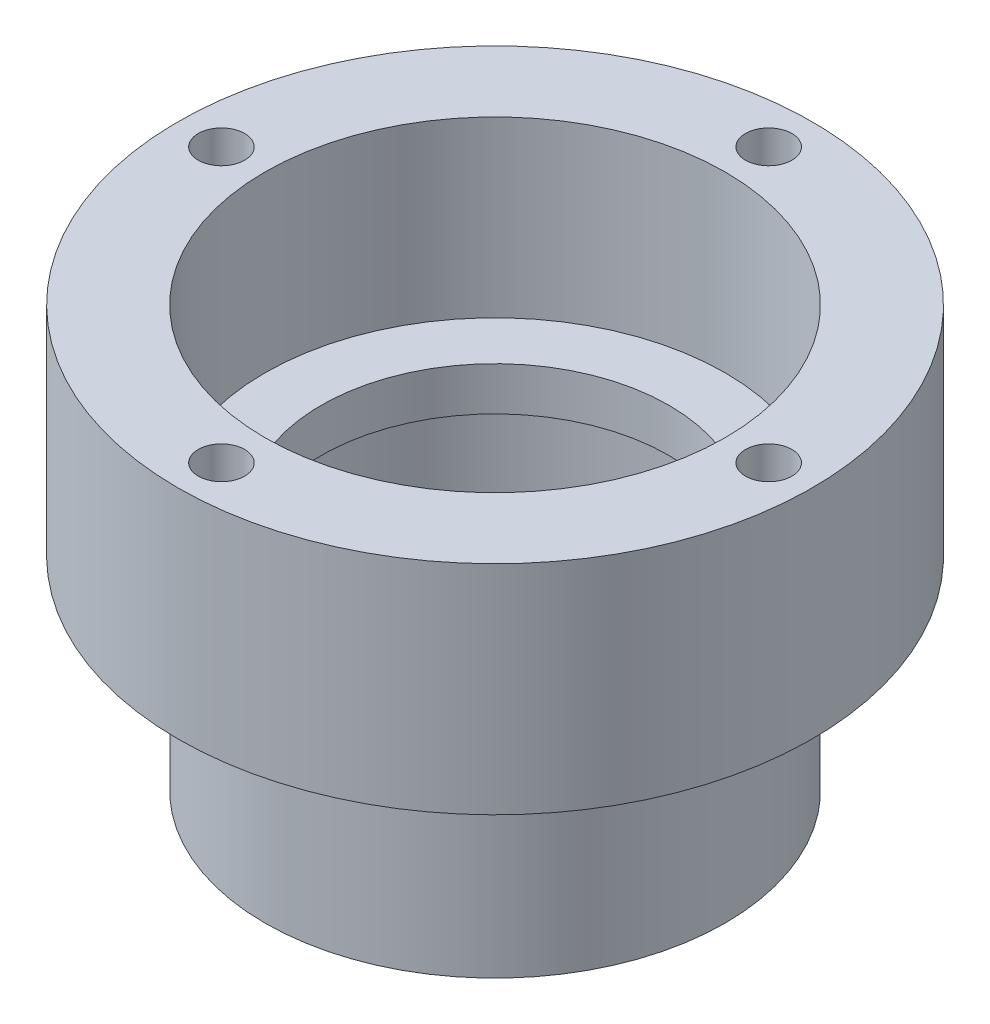
ISO-10303-21;
HEADER;
FILE_DESCRIPTION(('STEP AP214'),'2;1');
FILE_NAME('part.step','',(''),(''),'','','');
FILE_SCHEMA(('AUTOMOTIVE_DESIGN { 1 0 10303 214 1 1 1 1 }'));
ENDSEC;
DATA;
#1=APPLICATION_CONTEXT('core data for automotive mechanical design processes');
#2=APPLICATION_PROTOCOL_DEFINITION('international standard','automotive_design',2000,#1);
#3=PRODUCT_CONTEXT('',#1,'mechanical');
#4=PRODUCT('Part','Part','',(#3));
#5=PRODUCT_RELATED_PRODUCT_CATEGORY('part','',(#4));
#6=PRODUCT_DEFINITION_FORMATION('','',#4);
#7=PRODUCT_DEFINITION_CONTEXT('part definition',#1,'design');
#8=PRODUCT_DEFINITION('design','',#6,#7);
#9=PRODUCT_DEFINITION_SHAPE('','',#8);
#10=(LENGTH_UNIT() NAMED_UNIT(*) SI_UNIT(.MILLI.,.METRE.));
#11=(NAMED_UNIT(*) PLANE_ANGLE_UNIT() SI_UNIT($,.RADIAN.));
#12=(NAMED_UNIT(*) SI_UNIT($,.STERADIAN.) SOLID_ANGLE_UNIT());
#13=UNCERTAINTY_MEASURE_WITH_UNIT(LENGTH_MEASURE(1.E-05),#10,'distance_accuracy_value','');
#14=(GEOMETRIC_REPRESENTATION_CONTEXT(3) GLOBAL_UNCERTAINTY_ASSIGNED_CONTEXT((#13)) GLOBAL_UNIT_ASSIGNED_CONTEXT((#10,
#11,#12)) REPRESENTATION_CONTEXT('',''));
#15=CARTESIAN_POINT('',(0.,0.,0.));
#16=DIRECTION('',(0.,0.,1.));
#17=DIRECTION('',(1.,0.,0.));
#18=AXIS2_PLACEMENT_3D('',#15,#16,#17);
#19=CARTESIAN_POINT('',(0.,7.,0.));
#20=DIRECTION('',(0.,-1.,0.));
#21=DIRECTION('',(0.,0.,-1.));
#22=AXIS2_PLACEMENT_3D('',#19,#20,#21);
#23=CYLINDRICAL_SURFACE('',#22,7.9375);
#24=CARTESIAN_POINT('',(0.,0.,0.));
#25=DIRECTION('',(0.,1.,0.));
#26=DIRECTION('',(0.,0.,1.));
#27=AXIS2_PLACEMENT_3D('',#24,#25,#26);
#28=CIRCLE('',#27,7.9375);
#29=CARTESIAN_POINT('',(0.,0.,7.9375));
#30=VERTEX_POINT('',#29);
#31=EDGE_CURVE('E44',#30,#30,#28,.T.);
#32=ORIENTED_EDGE('',*,*,#31,.T.);
#33=EDGE_LOOP('',(#32));
#34=FACE_BOUND('',#33,.T.);
#35=CARTESIAN_POINT('',(0.,7.,0.));
#36=DIRECTION('',(0.,1.,0.));
#37=DIRECTION('',(0.,0.,1.));
#38=AXIS2_PLACEMENT_3D('',#35,#36,#37);
#39=CIRCLE('',#38,7.9375);
#40=CARTESIAN_POINT('',(0.,7.,7.9375));
#41=VERTEX_POINT('',#40);
#42=EDGE_CURVE('E40',#41,#41,#39,.T.);
#43=ORIENTED_EDGE('',*,*,#42,.F.);
#44=EDGE_LOOP('',(#43));
#45=FACE_BOUND('',#44,.T.);
#46=ADVANCED_FACE('F34',(#34,#45),#23,.T.);
#47=CARTESIAN_POINT('',(0.,0.,0.));
#48=DIRECTION('',(0.,1.,0.));
#49=DIRECTION('',(0.,0.,1.));
#50=AXIS2_PLACEMENT_3D('',#47,#48,#49);
#51=PLANE('',#50);
#52=ORIENTED_EDGE('',*,*,#31,.F.);
#53=EDGE_LOOP('',(#52));
#54=FACE_BOUND('',#53,.T.);
#55=CARTESIAN_POINT('',(0.,0.,0.));
#56=DIRECTION('',(0.,1.,0.));
#57=DIRECTION('',(0.,0.,1.));
#58=AXIS2_PLACEMENT_3D('',#55,#56,#57);
#59=CIRCLE('',#58,6.9375);
#60=CARTESIAN_POINT('',(0.,0.,6.9375));
#61=VERTEX_POINT('',#60);
#62=EDGE_CURVE('E49',#61,#61,#59,.T.);
#63=ORIENTED_EDGE('',*,*,#62,.T.);
#64=EDGE_LOOP('',(#63));
#65=FACE_BOUND('',#64,.T.);
#66=ADVANCED_FACE('F66',(#54,#65),#51,.F.);
#67=CARTESIAN_POINT('',(0.,7.,0.));
#68=DIRECTION('',(0.,-1.,0.));
#69=DIRECTION('',(0.,0.,-1.));
#70=AXIS2_PLACEMENT_3D('',#67,#68,#69);
#71=CYLINDRICAL_SURFACE('',#70,6.9375);
#72=CARTESIAN_POINT('',(0.,7.,0.));
#73=DIRECTION('',(0.,1.,0.));
#74=DIRECTION('',(0.,0.,1.));
#75=AXIS2_PLACEMENT_3D('',#72,#73,#74);
#76=CIRCLE('',#75,6.9375);
#77=CARTESIAN_POINT('',(0.,7.,6.9375));
#78=VERTEX_POINT('',#77);
#79=EDGE_CURVE('E57',#78,#78,#76,.T.);
#80=ORIENTED_EDGE('',*,*,#79,.T.);
#81=EDGE_LOOP('',(#80));
#82=FACE_BOUND('',#81,.T.);
#83=ORIENTED_EDGE('',*,*,#62,.F.);
#84=EDGE_LOOP('',(#83));
#85=FACE_BOUND('',#84,.T.);
#86=ADVANCED_FACE('F68',(#82,#85),#71,.F.);
#87=CARTESIAN_POINT('',(0.,7.,0.));
#88=DIRECTION('',(0.,1.,0.));
#89=DIRECTION('',(0.,0.,1.));
#90=AXIS2_PLACEMENT_3D('',#87,#88,#89);
#91=PLANE('',#90);
#92=CARTESIAN_POINT('',(0.,7.,0.));
#93=DIRECTION('',(0.,1.,0.));
#94=DIRECTION('',(0.,0.,1.));
#95=AXIS2_PLACEMENT_3D('',#92,#93,#94);
#96=CIRCLE('',#95,6.);
#97=CARTESIAN_POINT('',(0.,7.,6.));
#98=VERTEX_POINT('',#97);
#99=EDGE_CURVE('E58',#98,#98,#96,.T.);
#100=ORIENTED_EDGE('',*,*,#99,.T.);
#101=EDGE_LOOP('',(#100));
#102=FACE_BOUND('',#101,.T.);
#103=ORIENTED_EDGE('',*,*,#79,.F.);
#104=EDGE_LOOP('',(#103));
#105=FACE_BOUND('',#104,.T.);
#106=ADVANCED_FACE('F70',(#102,#105),#91,.F.);
#107=CARTESIAN_POINT('',(0.,8.5,0.));
#108=DIRECTION('',(0.,1.,0.));
#109=DIRECTION('',(0.,0.,1.));
#110=AXIS2_PLACEMENT_3D('',#107,#108,#109);
#111=PLANE('',#110);
#112=CARTESIAN_POINT('',(0.,8.5,0.));
#113=DIRECTION('',(0.,1.,0.));
#114=DIRECTION('',(0.,0.,1.));
#115=AXIS2_PLACEMENT_3D('',#112,#113,#114);
#116=CIRCLE('',#115,7.9375);
#117=CARTESIAN_POINT('',(0.,8.5,7.9375));
#118=VERTEX_POINT('',#117);
#119=EDGE_CURVE('E10',#118,#118,#116,.F.);
#120=ORIENTED_EDGE('',*,*,#119,.F.);
#121=EDGE_LOOP('',(#120));
#122=FACE_BOUND('',#121,.T.);
#123=CARTESIAN_POINT('',(0.,8.5,0.));
#124=DIRECTION('',(0.,1.,0.));
#125=DIRECTION('',(0.,0.,1.));
#126=AXIS2_PLACEMENT_3D('',#123,#124,#125);
#127=CIRCLE('',#126,6.);
#128=CARTESIAN_POINT('',(0.,8.5,6.));
#129=VERTEX_POINT('',#128);
#130=EDGE_CURVE('E54',#129,#129,#127,.T.);
#131=ORIENTED_EDGE('',*,*,#130,.F.);
#132=EDGE_LOOP('',(#131));
#133=FACE_BOUND('',#132,.T.);
#134=ADVANCED_FACE('F77',(#122,#133),#111,.T.);
#135=CARTESIAN_POINT('',(0.,8.5,0.));
#136=DIRECTION('',(0.,-1.,0.));
#137=DIRECTION('',(0.,0.,-1.));
#138=AXIS2_PLACEMENT_3D('',#135,#136,#137);
#139=CYLINDRICAL_SURFACE('',#138,6.);
#140=ORIENTED_EDGE('',*,*,#130,.T.);
#141=EDGE_LOOP('',(#140));
#142=FACE_BOUND('',#141,.T.);
#143=ORIENTED_EDGE('',*,*,#99,.F.);
#144=EDGE_LOOP('',(#143));
#145=FACE_BOUND('',#144,.T.);
#146=ADVANCED_FACE('F109',(#142,#145),#139,.F.);
#147=CARTESIAN_POINT('',(0.,7.,0.));
#148=DIRECTION('',(0.,1.,0.));
#149=DIRECTION('',(0.,0.,1.));
#150=AXIS2_PLACEMENT_3D('',#147,#148,#149);
#151=PLANE('',#150);
#152=CARTESIAN_POINT('',(0.,7.,0.));
#153=DIRECTION('',(0.,1.,0.));
#154=DIRECTION('',(0.,0.,1.));
#155=AXIS2_PLACEMENT_3D('',#152,#153,#154);
#156=CIRCLE('',#155,10.9375);
#157=CARTESIAN_POINT('',(0.,7.,10.9375));
#158=VERTEX_POINT('',#157);
#159=EDGE_CURVE('E52',#158,#158,#156,.T.);
#160=ORIENTED_EDGE('',*,*,#159,.F.);
#161=EDGE_LOOP('',(#160));
#162=FACE_BOUND('',#161,.T.);
#163=ORIENTED_EDGE('',*,*,#42,.T.);
#164=EDGE_LOOP('',(#163));
#165=FACE_BOUND('',#164,.T.);
#166=ADVANCED_FACE('F113',(#162,#165),#151,.F.);
#167=CARTESIAN_POINT('',(0.,-23.9359216769114,0.));
#168=DIRECTION('',(0.,1.,0.));
#169=DIRECTION('',(0.,0.,1.));
#170=AXIS2_PLACEMENT_3D('',#167,#168,#169);
#171=CYLINDRICAL_SURFACE('',#170,10.9375);
#172=ORIENTED_EDGE('',*,*,#159,.T.);
#173=EDGE_LOOP('',(#172));
#174=FACE_BOUND('',#173,.T.);
#175=CARTESIAN_POINT('',(0.,14.5,0.));
#176=DIRECTION('',(0.,1.,0.));
#177=DIRECTION('',(0.,0.,1.));
#178=AXIS2_PLACEMENT_3D('',#175,#176,#177);
#179=CIRCLE('',#178,10.9375);
#180=CARTESIAN_POINT('',(0.,14.5,10.9375));
#181=VERTEX_POINT('',#180);
#182=EDGE_CURVE('E333',#181,#181,#179,.T.);
#183=ORIENTED_EDGE('',*,*,#182,.F.);
#184=EDGE_LOOP('',(#183));
#185=FACE_BOUND('',#184,.T.);
#186=ADVANCED_FACE('F125',(#174,#185),#171,.T.);
#187=CARTESIAN_POINT('',(0.,14.5,0.));
#188=DIRECTION('',(0.,1.,0.));
#189=DIRECTION('',(0.,0.,1.));
#190=AXIS2_PLACEMENT_3D('',#187,#188,#189);
#191=PLANE('',#190);
#192=CARTESIAN_POINT('',(0.,14.5,-9.4375));
#193=DIRECTION('',(0.,1.,0.));
#194=DIRECTION('',(0.,0.,1.));
#195=AXIS2_PLACEMENT_3D('',#192,#193,#194);
#196=CIRCLE('',#195,0.79999999999999);
#197=CARTESIAN_POINT('',(0.,14.5,-8.63750000000001));
#198=VERTEX_POINT('',#197);
#199=EDGE_CURVE('E356',#198,#198,#196,.T.);
#200=ORIENTED_EDGE('',*,*,#199,.F.);
#201=EDGE_LOOP('',(#200));
#202=FACE_BOUND('',#201,.T.);
#203=CARTESIAN_POINT('',(9.4375,14.5,0.));
#204=DIRECTION('',(0.,1.,0.));
#205=DIRECTION('',(0.,0.,1.));
#206=AXIS2_PLACEMENT_3D('',#203,#204,#205);
#207=CIRCLE('',#206,0.79999999999999);
#208=CARTESIAN_POINT('',(9.4375,14.5,0.79999999999999));
#209=VERTEX_POINT('',#208);
#210=EDGE_CURVE('E350',#209,#209,#207,.T.);
#211=ORIENTED_EDGE('',*,*,#210,.F.);
#212=EDGE_LOOP('',(#211));
#213=FACE_BOUND('',#212,.T.);
#214=CARTESIAN_POINT('',(0.,14.5,9.4375));
#215=DIRECTION('',(0.,1.,0.));
#216=DIRECTION('',(0.,0.,1.));
#217=AXIS2_PLACEMENT_3D('',#214,#215,#216);
#218=CIRCLE('',#217,0.79999999999999);
#219=CARTESIAN_POINT('',(0.,14.5,10.2375));
#220=VERTEX_POINT('',#219);
#221=EDGE_CURVE('E346',#220,#220,#218,.T.);
#222=ORIENTED_EDGE('',*,*,#221,.F.);
#223=EDGE_LOOP('',(#222));
#224=FACE_BOUND('',#223,.T.);
#225=CARTESIAN_POINT('',(-9.4375,14.5,0.));
#226=DIRECTION('',(0.,1.,0.));
#227=DIRECTION('',(0.,0.,1.));
#228=AXIS2_PLACEMENT_3D('',#225,#226,#227);
#229=CIRCLE('',#228,0.79999999999999);
#230=CARTESIAN_POINT('',(-9.4375,14.5,0.79999999999999));
#231=VERTEX_POINT('',#230);
#232=EDGE_CURVE('E336',#231,#231,#229,.T.);
#233=ORIENTED_EDGE('',*,*,#232,.F.);
#234=EDGE_LOOP('',(#233));
#235=FACE_BOUND('',#234,.T.);
#236=ORIENTED_EDGE('',*,*,#182,.T.);
#237=EDGE_LOOP('',(#236));
#238=FACE_BOUND('',#237,.T.);
#239=CARTESIAN_POINT('',(0.,14.5,0.));
#240=DIRECTION('',(0.,1.,0.));
#241=DIRECTION('',(0.,0.,1.));
#242=AXIS2_PLACEMENT_3D('',#239,#240,#241);
#243=CIRCLE('',#242,7.9375);
#244=CARTESIAN_POINT('',(0.,14.5,7.9375));
#245=VERTEX_POINT('',#244);
#246=EDGE_CURVE('E329',#245,#245,#243,.T.);
#247=ORIENTED_EDGE('',*,*,#246,.F.);
#248=EDGE_LOOP('',(#247));
#249=FACE_BOUND('',#248,.T.);
#250=ADVANCED_FACE('F133',(#202,#213,#224,#235,#238,#249),#191,.T.);
#251=CARTESIAN_POINT('',(0.,14.5,0.));
#252=DIRECTION('',(0.,-1.,0.));
#253=DIRECTION('',(0.,0.,-1.));
#254=AXIS2_PLACEMENT_3D('',#251,#252,#253);
#255=CYLINDRICAL_SURFACE('',#254,7.9375);
#256=ORIENTED_EDGE('',*,*,#246,.T.);
#257=EDGE_LOOP('',(#256));
#258=FACE_BOUND('',#257,.T.);
#259=ORIENTED_EDGE('',*,*,#119,.T.);
#260=EDGE_LOOP('',(#259));
#261=FACE_BOUND('',#260,.T.);
#262=ADVANCED_FACE('F141',(#258,#261),#255,.F.);
#263=CARTESIAN_POINT('',(-9.4375,8.8,0.));
#264=DIRECTION('',(0.,1.,0.));
#265=DIRECTION('',(0.,0.,1.));
#266=AXIS2_PLACEMENT_3D('',#263,#264,#265);
#267=CONICAL_SURFACE('',#266,0.799999999999999,1.02974425867665);
#268=CARTESIAN_POINT('',(-9.4375,8.8,0.));
#269=DIRECTION('',(0.,1.,0.));
#270=DIRECTION('',(0.,0.,1.));
#271=AXIS2_PLACEMENT_3D('',#268,#269,#270);
#272=CIRCLE('',#271,0.799999999999999);
#273=CARTESIAN_POINT('',(-9.4375,8.8,0.799999999999999));
#274=VERTEX_POINT('',#273);
#275=EDGE_CURVE('E330',#274,#274,#272,.T.);
#276=ORIENTED_EDGE('',*,*,#275,.T.);
#277=EDGE_LOOP('',(#276));
#278=FACE_BOUND('',#277,.T.);
#279=CARTESIAN_POINT('',(-9.4375,8.5,0.));
#280=DIRECTION('',(0.,1.,0.));
#281=DIRECTION('',(0.,0.,1.));
#282=AXIS2_PLACEMENT_3D('',#279,#280,#281);
#283=CIRCLE('',#282,0.300716155294846);
#284=CARTESIAN_POINT('',(-9.4375,8.5,0.300716155294846));
#285=VERTEX_POINT('',#284);
#286=EDGE_CURVE('E327',#285,#285,#283,.T.);
#287=ORIENTED_EDGE('',*,*,#286,.F.);
#288=EDGE_LOOP('',(#287));
#289=FACE_BOUND('',#288,.T.);
#290=ADVANCED_FACE('F149',(#278,#289),#267,.F.);
#291=CARTESIAN_POINT('',(-9.4375,14.5,0.));
#292=DIRECTION('',(0.,1.,0.));
#293=DIRECTION('',(0.,0.,1.));
#294=AXIS2_PLACEMENT_3D('',#291,#292,#293);
#295=CYLINDRICAL_SURFACE('',#294,0.799999999999994);
#296=ORIENTED_EDGE('',*,*,#275,.F.);
#297=EDGE_LOOP('',(#296));
#298=FACE_BOUND('',#297,.T.);
#299=ORIENTED_EDGE('',*,*,#232,.T.);
#300=EDGE_LOOP('',(#299));
#301=FACE_BOUND('',#300,.T.);
#302=ADVANCED_FACE('F157',(#298,#301),#295,.F.);
#303=CARTESIAN_POINT('',(0.,8.8,9.4375));
#304=DIRECTION('',(0.,1.,0.));
#305=DIRECTION('',(0.,0.,1.));
#306=AXIS2_PLACEMENT_3D('',#303,#304,#305);
#307=CONICAL_SURFACE('',#306,0.799999999999999,1.02974425867665);
#308=CARTESIAN_POINT('',(0.,8.8,9.4375));
#309=DIRECTION('',(0.,1.,0.));
#310=DIRECTION('',(0.,0.,1.));
#311=AXIS2_PLACEMENT_3D('',#308,#309,#310);
#312=CIRCLE('',#311,0.799999999999999);
#313=CARTESIAN_POINT('',(0.,8.8,10.2375));
#314=VERTEX_POINT('',#313);
#315=EDGE_CURVE('E343',#314,#314,#312,.T.);
#316=ORIENTED_EDGE('',*,*,#315,.T.);
#317=EDGE_LOOP('',(#316));
#318=FACE_BOUND('',#317,.T.);
#319=CARTESIAN_POINT('',(0.,8.5,9.4375));
#320=DIRECTION('',(0.,1.,0.));
#321=DIRECTION('',(0.,0.,1.));
#322=AXIS2_PLACEMENT_3D('',#319,#320,#321);
#323=CIRCLE('',#322,0.300716155294846);
#324=CARTESIAN_POINT('',(0.,8.5,9.73821615529484));
#325=VERTEX_POINT('',#324);
#326=EDGE_CURVE('E340',#325,#325,#323,.T.);
#327=ORIENTED_EDGE('',*,*,#326,.F.);
#328=EDGE_LOOP('',(#327));
#329=FACE_BOUND('',#328,.T.);
#330=ADVANCED_FACE('F166',(#318,#329),#307,.F.);
#331=CARTESIAN_POINT('',(0.,14.5,9.4375));
#332=DIRECTION('',(0.,1.,0.));
#333=DIRECTION('',(0.,0.,1.));
#334=AXIS2_PLACEMENT_3D('',#331,#332,#333);
#335=CYLINDRICAL_SURFACE('',#334,0.799999999999994);
#336=ORIENTED_EDGE('',*,*,#315,.F.);
#337=EDGE_LOOP('',(#336));
#338=FACE_BOUND('',#337,.T.);
#339=ORIENTED_EDGE('',*,*,#221,.T.);
#340=EDGE_LOOP('',(#339));
#341=FACE_BOUND('',#340,.T.);
#342=ADVANCED_FACE('F175',(#338,#341),#335,.F.);
#343=CARTESIAN_POINT('',(9.4375,8.8,0.));
#344=DIRECTION('',(0.,1.,0.));
#345=DIRECTION('',(0.,0.,1.));
#346=AXIS2_PLACEMENT_3D('',#343,#344,#345);
#347=CONICAL_SURFACE('',#346,0.799999999999999,1.02974425867665);
#348=CARTESIAN_POINT('',(9.4375,8.8,0.));
#349=DIRECTION('',(0.,1.,0.));
#350=DIRECTION('',(0.,0.,1.));
#351=AXIS2_PLACEMENT_3D('',#348,#349,#350);
#352=CIRCLE('',#351,0.799999999999999);
#353=CARTESIAN_POINT('',(9.4375,8.8,0.799999999999999));
#354=VERTEX_POINT('',#353);
#355=EDGE_CURVE('E347',#354,#354,#352,.T.);
#356=ORIENTED_EDGE('',*,*,#355,.T.);
#357=EDGE_LOOP('',(#356));
#358=FACE_BOUND('',#357,.T.);
#359=CARTESIAN_POINT('',(9.4375,8.5,0.));
#360=DIRECTION('',(0.,1.,0.));
#361=DIRECTION('',(0.,0.,1.));
#362=AXIS2_PLACEMENT_3D('',#359,#360,#361);
#363=CIRCLE('',#362,0.300716155294846);
#364=CARTESIAN_POINT('',(9.4375,8.5,0.300716155294846));
#365=VERTEX_POINT('',#364);
#366=EDGE_CURVE('E344',#365,#365,#363,.T.);
#367=ORIENTED_EDGE('',*,*,#366,.F.);
#368=EDGE_LOOP('',(#367));
#369=FACE_BOUND('',#368,.T.);
#370=ADVANCED_FACE('F183',(#358,#369),#347,.F.);
#371=CARTESIAN_POINT('',(9.4375,14.5,0.));
#372=DIRECTION('',(0.,1.,0.));
#373=DIRECTION('',(0.,0.,1.));
#374=AXIS2_PLACEMENT_3D('',#371,#372,#373);
#375=CYLINDRICAL_SURFACE('',#374,0.799999999999994);
#376=ORIENTED_EDGE('',*,*,#355,.F.);
#377=EDGE_LOOP('',(#376));
#378=FACE_BOUND('',#377,.T.);
#379=ORIENTED_EDGE('',*,*,#210,.T.);
#380=EDGE_LOOP('',(#379));
#381=FACE_BOUND('',#380,.T.);
#382=ADVANCED_FACE('F192',(#378,#381),#375,.F.);
#383=CARTESIAN_POINT('',(0.,8.8,-9.4375));
#384=DIRECTION('',(0.,1.,0.));
#385=DIRECTION('',(0.,0.,1.));
#386=AXIS2_PLACEMENT_3D('',#383,#384,#385);
#387=CONICAL_SURFACE('',#386,0.799999999999999,1.02974425867665);
#388=CARTESIAN_POINT('',(0.,8.8,-9.4375));
#389=DIRECTION('',(0.,1.,0.));
#390=DIRECTION('',(0.,0.,1.));
#391=AXIS2_PLACEMENT_3D('',#388,#389,#390);
#392=CIRCLE('',#391,0.799999999999999);
#393=CARTESIAN_POINT('',(0.,8.8,-8.6375));
#394=VERTEX_POINT('',#393);
#395=EDGE_CURVE('E351',#394,#394,#392,.T.);
#396=ORIENTED_EDGE('',*,*,#395,.T.);
#397=EDGE_LOOP('',(#396));
#398=FACE_BOUND('',#397,.T.);
#399=CARTESIAN_POINT('',(0.,8.5,-9.4375));
#400=DIRECTION('',(0.,1.,0.));
#401=DIRECTION('',(0.,0.,1.));
#402=AXIS2_PLACEMENT_3D('',#399,#400,#401);
#403=CIRCLE('',#402,0.300716155294846);
#404=CARTESIAN_POINT('',(0.,8.5,-9.13678384470515));
#405=VERTEX_POINT('',#404);
#406=EDGE_CURVE('E348',#405,#405,#403,.T.);
#407=ORIENTED_EDGE('',*,*,#406,.F.);
#408=EDGE_LOOP('',(#407));
#409=FACE_BOUND('',#408,.T.);
#410=ADVANCED_FACE('F200',(#398,#409),#387,.F.);
#411=CARTESIAN_POINT('',(0.,14.5,-9.4375));
#412=DIRECTION('',(0.,1.,0.));
#413=DIRECTION('',(0.,0.,1.));
#414=AXIS2_PLACEMENT_3D('',#411,#412,#413);
#415=CYLINDRICAL_SURFACE('',#414,0.799999999999994);
#416=ORIENTED_EDGE('',*,*,#395,.F.);
#417=EDGE_LOOP('',(#416));
#418=FACE_BOUND('',#417,.T.);
#419=ORIENTED_EDGE('',*,*,#199,.T.);
#420=EDGE_LOOP('',(#419));
#421=FACE_BOUND('',#420,.T.);
#422=ADVANCED_FACE('F209',(#418,#421),#415,.F.);
#423=ORIENTED_EDGE('',*,*,#406,.T.);
#424=EDGE_LOOP('',(#423));
#425=FACE_BOUND('',#424,.T.);
#426=ADVANCED_FACE('F217',(#425),#111,.T.);
#427=ORIENTED_EDGE('',*,*,#366,.T.);
#428=EDGE_LOOP('',(#427));
#429=FACE_BOUND('',#428,.T.);
#430=ADVANCED_FACE('F225',(#429),#111,.T.);
#431=ORIENTED_EDGE('',*,*,#326,.T.);
#432=EDGE_LOOP('',(#431));
#433=FACE_BOUND('',#432,.T.);
#434=ADVANCED_FACE('F233',(#433),#111,.T.);
#435=ORIENTED_EDGE('',*,*,#286,.T.);
#436=EDGE_LOOP('',(#435));
#437=FACE_BOUND('',#436,.T.);
#438=ADVANCED_FACE('F240',(#437),#111,.T.);
#439=CLOSED_SHELL('',(#46,#66,#86,#106,#134,#146,#166,#186,#250,#262,#290,#302,#330,#342,#370,
#382,#410,#422,#426,#430,#434,#438));
#440=MANIFOLD_SOLID_BREP('B2',#439);
#441=ADVANCED_BREP_SHAPE_REPRESENTATION('',(#18,#440),#14);
#442=SHAPE_DEFINITION_REPRESENTATION(#9,#441);
ENDSEC;
END-ISO-10303-21;
